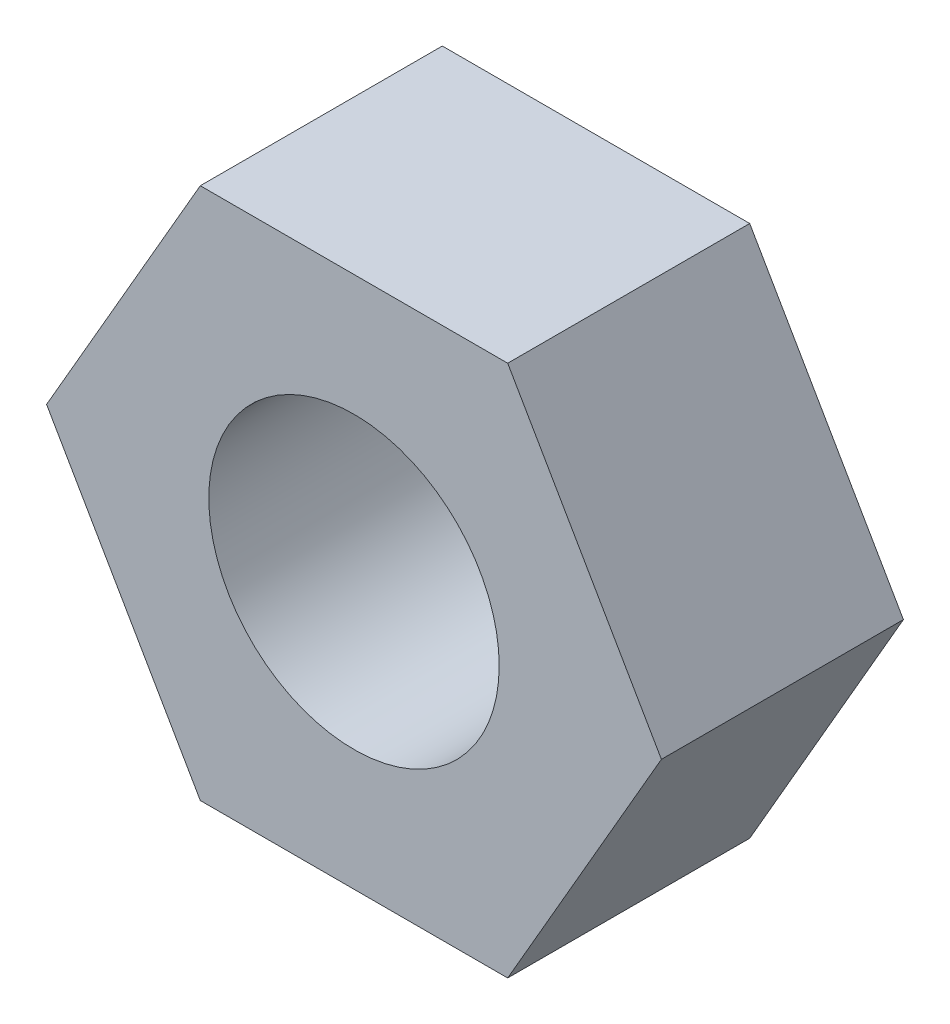
ISO-10303-21;
HEADER;
FILE_DESCRIPTION(('STEP AP214'),'2;1');
FILE_NAME('part.step','',(''),(''),'','','');
FILE_SCHEMA(('AUTOMOTIVE_DESIGN { 1 0 10303 214 1 1 1 1 }'));
ENDSEC;
DATA;
#1=APPLICATION_CONTEXT('core data for automotive mechanical design processes');
#2=APPLICATION_PROTOCOL_DEFINITION('international standard','automotive_design',2000,#1);
#3=PRODUCT_CONTEXT('',#1,'mechanical');
#4=PRODUCT('Part','Part','',(#3));
#5=PRODUCT_RELATED_PRODUCT_CATEGORY('part','',(#4));
#6=PRODUCT_DEFINITION_FORMATION('','',#4);
#7=PRODUCT_DEFINITION_CONTEXT('part definition',#1,'design');
#8=PRODUCT_DEFINITION('design','',#6,#7);
#9=PRODUCT_DEFINITION_SHAPE('','',#8);
#10=(LENGTH_UNIT() NAMED_UNIT(*) SI_UNIT(.MILLI.,.METRE.));
#11=(NAMED_UNIT(*) PLANE_ANGLE_UNIT() SI_UNIT($,.RADIAN.));
#12=(NAMED_UNIT(*) SI_UNIT($,.STERADIAN.) SOLID_ANGLE_UNIT());
#13=UNCERTAINTY_MEASURE_WITH_UNIT(LENGTH_MEASURE(1.E-05),#10,'distance_accuracy_value','');
#14=(GEOMETRIC_REPRESENTATION_CONTEXT(3) GLOBAL_UNCERTAINTY_ASSIGNED_CONTEXT((#13)) GLOBAL_UNIT_ASSIGNED_CONTEXT((#10,
#11,#12)) REPRESENTATION_CONTEXT('',''));
#15=CARTESIAN_POINT('',(0.,0.,0.));
#16=DIRECTION('',(0.,0.,1.));
#17=DIRECTION('',(1.,0.,0.));
#18=AXIS2_PLACEMENT_3D('',#15,#16,#17);
#19=CARTESIAN_POINT('',(0.,0.,2.5));
#20=DIRECTION('',(0.,0.,1.));
#21=DIRECTION('',(1.,0.,0.));
#22=AXIS2_PLACEMENT_3D('',#19,#20,#21);
#23=PLANE('',#22);
#24=DIRECTION('',(0.5,0.866025403784439,0.));
#25=VECTOR('',#24,1.);
#26=CARTESIAN_POINT('',(1.58771324027147,-2.75,2.5));
#27=LINE('',#26,#25);
#28=CARTESIAN_POINT('',(1.58771324027147,-2.75,2.5));
#29=VERTEX_POINT('',#28);
#30=CARTESIAN_POINT('',(3.17542648054294,0.,2.5));
#31=VERTEX_POINT('',#30);
#32=EDGE_CURVE('E146',#29,#31,#27,.T.);
#33=ORIENTED_EDGE('',*,*,#32,.T.);
#34=DIRECTION('',(-0.5,0.866025403784438,0.));
#35=VECTOR('',#34,1.);
#36=CARTESIAN_POINT('',(3.17542648054294,0.,2.5));
#37=LINE('',#36,#35);
#38=CARTESIAN_POINT('',(1.58771324027147,2.75,2.5));
#39=VERTEX_POINT('',#38);
#40=EDGE_CURVE('E94',#31,#39,#37,.T.);
#41=ORIENTED_EDGE('',*,*,#40,.T.);
#42=DIRECTION('',(-1.,0.,0.));
#43=VECTOR('',#42,1.);
#44=CARTESIAN_POINT('',(1.58771324027147,2.75,2.5));
#45=LINE('',#44,#43);
#46=CARTESIAN_POINT('',(-1.58771324027147,2.75,2.5));
#47=VERTEX_POINT('',#46);
#48=EDGE_CURVE('E107',#39,#47,#45,.T.);
#49=ORIENTED_EDGE('',*,*,#48,.T.);
#50=DIRECTION('',(-0.5,-0.866025403784439,0.));
#51=VECTOR('',#50,1.);
#52=CARTESIAN_POINT('',(-1.58771324027147,2.75,2.5));
#53=LINE('',#52,#51);
#54=CARTESIAN_POINT('',(-3.17542648054294,0.,2.5));
#55=VERTEX_POINT('',#54);
#56=EDGE_CURVE('E101',#47,#55,#53,.T.);
#57=ORIENTED_EDGE('',*,*,#56,.T.);
#58=DIRECTION('',(0.5,-0.866025403784439,0.));
#59=VECTOR('',#58,1.);
#60=CARTESIAN_POINT('',(-3.17542648054294,0.,2.5));
#61=LINE('',#60,#59);
#62=CARTESIAN_POINT('',(-1.58771324027147,-2.75,2.5));
#63=VERTEX_POINT('',#62);
#64=EDGE_CURVE('E105',#55,#63,#61,.T.);
#65=ORIENTED_EDGE('',*,*,#64,.T.);
#66=DIRECTION('',(1.,0.,0.));
#67=VECTOR('',#66,1.);
#68=CARTESIAN_POINT('',(-1.58771324027147,-2.75,2.5));
#69=LINE('',#68,#67);
#70=EDGE_CURVE('E57',#63,#29,#69,.T.);
#71=ORIENTED_EDGE('',*,*,#70,.T.);
#72=EDGE_LOOP('',(#33,#41,#49,#57,#65,#71));
#73=FACE_BOUND('',#72,.T.);
#74=CARTESIAN_POINT('',(0.,0.,2.5));
#75=DIRECTION('',(0.,0.,1.));
#76=DIRECTION('',(1.,0.,0.));
#77=AXIS2_PLACEMENT_3D('',#74,#75,#76);
#78=CIRCLE('',#77,1.5);
#79=CARTESIAN_POINT('',(1.5,0.,2.5));
#80=VERTEX_POINT('',#79);
#81=EDGE_CURVE('E134',#80,#80,#78,.T.);
#82=ORIENTED_EDGE('',*,*,#81,.F.);
#83=EDGE_LOOP('',(#82));
#84=FACE_BOUND('',#83,.T.);
#85=ADVANCED_FACE('F39',(#73,#84),#23,.T.);
#86=CARTESIAN_POINT('',(0.,0.,0.));
#87=DIRECTION('',(0.,0.,1.));
#88=DIRECTION('',(1.,0.,0.));
#89=AXIS2_PLACEMENT_3D('',#86,#87,#88);
#90=PLANE('',#89);
#91=DIRECTION('',(0.5,0.866025403784439,0.));
#92=VECTOR('',#91,1.);
#93=CARTESIAN_POINT('',(1.58771324027147,-2.75,0.));
#94=LINE('',#93,#92);
#95=CARTESIAN_POINT('',(1.58771324027147,-2.75,0.));
#96=VERTEX_POINT('',#95);
#97=CARTESIAN_POINT('',(3.17542648054294,0.,0.));
#98=VERTEX_POINT('',#97);
#99=EDGE_CURVE('E129',#96,#98,#94,.T.);
#100=ORIENTED_EDGE('',*,*,#99,.F.);
#101=DIRECTION('',(1.,0.,0.));
#102=VECTOR('',#101,1.);
#103=CARTESIAN_POINT('',(-1.58771324027147,-2.75,0.));
#104=LINE('',#103,#102);
#105=CARTESIAN_POINT('',(-1.58771324027147,-2.75,0.));
#106=VERTEX_POINT('',#105);
#107=EDGE_CURVE('E86',#106,#96,#104,.T.);
#108=ORIENTED_EDGE('',*,*,#107,.F.);
#109=DIRECTION('',(0.5,-0.866025403784439,0.));
#110=VECTOR('',#109,1.);
#111=CARTESIAN_POINT('',(-3.17542648054294,0.,0.));
#112=LINE('',#111,#110);
#113=CARTESIAN_POINT('',(-3.17542648054294,0.,0.));
#114=VERTEX_POINT('',#113);
#115=EDGE_CURVE('E80',#114,#106,#112,.T.);
#116=ORIENTED_EDGE('',*,*,#115,.F.);
#117=DIRECTION('',(-0.5,-0.866025403784439,0.));
#118=VECTOR('',#117,1.);
#119=CARTESIAN_POINT('',(-1.58771324027147,2.75,0.));
#120=LINE('',#119,#118);
#121=CARTESIAN_POINT('',(-1.58771324027147,2.75,0.));
#122=VERTEX_POINT('',#121);
#123=EDGE_CURVE('E116',#122,#114,#120,.T.);
#124=ORIENTED_EDGE('',*,*,#123,.F.);
#125=DIRECTION('',(-1.,0.,0.));
#126=VECTOR('',#125,1.);
#127=CARTESIAN_POINT('',(1.58771324027147,2.75,0.));
#128=LINE('',#127,#126);
#129=CARTESIAN_POINT('',(1.58771324027147,2.75,0.));
#130=VERTEX_POINT('',#129);
#131=EDGE_CURVE('E137',#130,#122,#128,.T.);
#132=ORIENTED_EDGE('',*,*,#131,.F.);
#133=DIRECTION('',(-0.5,0.866025403784438,0.));
#134=VECTOR('',#133,1.);
#135=CARTESIAN_POINT('',(3.17542648054294,0.,0.));
#136=LINE('',#135,#134);
#137=EDGE_CURVE('E133',#98,#130,#136,.T.);
#138=ORIENTED_EDGE('',*,*,#137,.F.);
#139=EDGE_LOOP('',(#100,#108,#116,#124,#132,#138));
#140=FACE_BOUND('',#139,.T.);
#141=CARTESIAN_POINT('',(0.,0.,0.));
#142=DIRECTION('',(0.,0.,1.));
#143=DIRECTION('',(1.,0.,0.));
#144=AXIS2_PLACEMENT_3D('',#141,#142,#143);
#145=CIRCLE('',#144,1.5);
#146=CARTESIAN_POINT('',(1.5,0.,0.));
#147=VERTEX_POINT('',#146);
#148=EDGE_CURVE('E243',#147,#147,#145,.T.);
#149=ORIENTED_EDGE('',*,*,#148,.T.);
#150=EDGE_LOOP('',(#149));
#151=FACE_BOUND('',#150,.T.);
#152=ADVANCED_FACE('F159',(#140,#151),#90,.F.);
#153=CARTESIAN_POINT('',(1.58771324027147,-2.75,2.5));
#154=DIRECTION('',(-0.866025403784439,0.5,0.));
#155=DIRECTION('',(-0.5,-0.866025403784439,0.));
#156=AXIS2_PLACEMENT_3D('',#153,#154,#155);
#157=PLANE('',#156);
#158=ORIENTED_EDGE('',*,*,#99,.T.);
#159=DIRECTION('',(0.,0.,-1.));
#160=VECTOR('',#159,1.);
#161=CARTESIAN_POINT('',(3.17542648054294,0.,2.5));
#162=LINE('',#161,#160);
#163=EDGE_CURVE('E11',#31,#98,#162,.T.);
#164=ORIENTED_EDGE('',*,*,#163,.F.);
#165=ORIENTED_EDGE('',*,*,#32,.F.);
#166=DIRECTION('',(0.,0.,-1.));
#167=VECTOR('',#166,1.);
#168=CARTESIAN_POINT('',(1.58771324027147,-2.75,2.5));
#169=LINE('',#168,#167);
#170=EDGE_CURVE('E125',#29,#96,#169,.T.);
#171=ORIENTED_EDGE('',*,*,#170,.T.);
#172=EDGE_LOOP('',(#158,#164,#165,#171));
#173=FACE_BOUND('',#172,.T.);
#174=ADVANCED_FACE('F41',(#173),#157,.F.);
#175=CARTESIAN_POINT('',(3.17542648054294,0.,2.5));
#176=DIRECTION('',(-0.866025403784438,-0.5,0.));
#177=DIRECTION('',(0.5,-0.866025403784438,0.));
#178=AXIS2_PLACEMENT_3D('',#175,#176,#177);
#179=PLANE('',#178);
#180=ORIENTED_EDGE('',*,*,#137,.T.);
#181=DIRECTION('',(0.,0.,-1.));
#182=VECTOR('',#181,1.);
#183=CARTESIAN_POINT('',(1.58771324027147,2.75,2.5));
#184=LINE('',#183,#182);
#185=EDGE_CURVE('E49',#39,#130,#184,.T.);
#186=ORIENTED_EDGE('',*,*,#185,.F.);
#187=ORIENTED_EDGE('',*,*,#40,.F.);
#188=ORIENTED_EDGE('',*,*,#163,.T.);
#189=EDGE_LOOP('',(#180,#186,#187,#188));
#190=FACE_BOUND('',#189,.T.);
#191=ADVANCED_FACE('F184',(#190),#179,.F.);
#192=CARTESIAN_POINT('',(1.58771324027147,2.75,2.5));
#193=DIRECTION('',(0.,-1.,0.));
#194=DIRECTION('',(1.,0.,0.));
#195=AXIS2_PLACEMENT_3D('',#192,#193,#194);
#196=PLANE('',#195);
#197=ORIENTED_EDGE('',*,*,#131,.T.);
#198=DIRECTION('',(0.,0.,-1.));
#199=VECTOR('',#198,1.);
#200=CARTESIAN_POINT('',(-1.58771324027147,2.75,2.5));
#201=LINE('',#200,#199);
#202=EDGE_CURVE('E118',#47,#122,#201,.T.);
#203=ORIENTED_EDGE('',*,*,#202,.F.);
#204=ORIENTED_EDGE('',*,*,#48,.F.);
#205=ORIENTED_EDGE('',*,*,#185,.T.);
#206=EDGE_LOOP('',(#197,#203,#204,#205));
#207=FACE_BOUND('',#206,.T.);
#208=ADVANCED_FACE('F156',(#207),#196,.F.);
#209=CARTESIAN_POINT('',(-1.58771324027147,2.75,2.5));
#210=DIRECTION('',(0.866025403784439,-0.5,0.));
#211=DIRECTION('',(0.5,0.866025403784439,0.));
#212=AXIS2_PLACEMENT_3D('',#209,#210,#211);
#213=PLANE('',#212);
#214=ORIENTED_EDGE('',*,*,#123,.T.);
#215=DIRECTION('',(0.,0.,-1.));
#216=VECTOR('',#215,1.);
#217=CARTESIAN_POINT('',(-3.17542648054294,0.,2.5));
#218=LINE('',#217,#216);
#219=EDGE_CURVE('E113',#55,#114,#218,.T.);
#220=ORIENTED_EDGE('',*,*,#219,.F.);
#221=ORIENTED_EDGE('',*,*,#56,.F.);
#222=ORIENTED_EDGE('',*,*,#202,.T.);
#223=EDGE_LOOP('',(#214,#220,#221,#222));
#224=FACE_BOUND('',#223,.T.);
#225=ADVANCED_FACE('F114',(#224),#213,.F.);
#226=CARTESIAN_POINT('',(-3.17542648054294,0.,2.5));
#227=DIRECTION('',(0.866025403784439,0.5,0.));
#228=DIRECTION('',(-0.5,0.866025403784439,0.));
#229=AXIS2_PLACEMENT_3D('',#226,#227,#228);
#230=PLANE('',#229);
#231=ORIENTED_EDGE('',*,*,#115,.T.);
#232=DIRECTION('',(0.,0.,-1.));
#233=VECTOR('',#232,1.);
#234=CARTESIAN_POINT('',(-1.58771324027147,-2.75,2.5));
#235=LINE('',#234,#233);
#236=EDGE_CURVE('E119',#63,#106,#235,.T.);
#237=ORIENTED_EDGE('',*,*,#236,.F.);
#238=ORIENTED_EDGE('',*,*,#64,.F.);
#239=ORIENTED_EDGE('',*,*,#219,.T.);
#240=EDGE_LOOP('',(#231,#237,#238,#239));
#241=FACE_BOUND('',#240,.T.);
#242=ADVANCED_FACE('F121',(#241),#230,.F.);
#243=CARTESIAN_POINT('',(-1.58771324027147,-2.75,2.5));
#244=DIRECTION('',(0.,1.,0.));
#245=DIRECTION('',(0.,0.,1.));
#246=AXIS2_PLACEMENT_3D('',#243,#244,#245);
#247=PLANE('',#246);
#248=ORIENTED_EDGE('',*,*,#107,.T.);
#249=ORIENTED_EDGE('',*,*,#170,.F.);
#250=ORIENTED_EDGE('',*,*,#70,.F.);
#251=ORIENTED_EDGE('',*,*,#236,.T.);
#252=EDGE_LOOP('',(#248,#249,#250,#251));
#253=FACE_BOUND('',#252,.T.);
#254=ADVANCED_FACE('F164',(#253),#247,.F.);
#255=CARTESIAN_POINT('',(0.,0.,2.5));
#256=DIRECTION('',(0.,0.,-1.));
#257=DIRECTION('',(-1.,0.,0.));
#258=AXIS2_PLACEMENT_3D('',#255,#256,#257);
#259=CYLINDRICAL_SURFACE('',#258,1.5);
#260=ORIENTED_EDGE('',*,*,#81,.T.);
#261=EDGE_LOOP('',(#260));
#262=FACE_BOUND('',#261,.T.);
#263=ORIENTED_EDGE('',*,*,#148,.F.);
#264=EDGE_LOOP('',(#263));
#265=FACE_BOUND('',#264,.T.);
#266=ADVANCED_FACE('F166',(#262,#265),#259,.F.);
#267=CLOSED_SHELL('',(#85,#152,#174,#191,#208,#225,#242,#254,#266));
#268=MANIFOLD_SOLID_BREP('B2',#267);
#269=ADVANCED_BREP_SHAPE_REPRESENTATION('',(#18,#268),#14);
#270=SHAPE_DEFINITION_REPRESENTATION(#9,#269);
ENDSEC;
END-ISO-10303-21;
